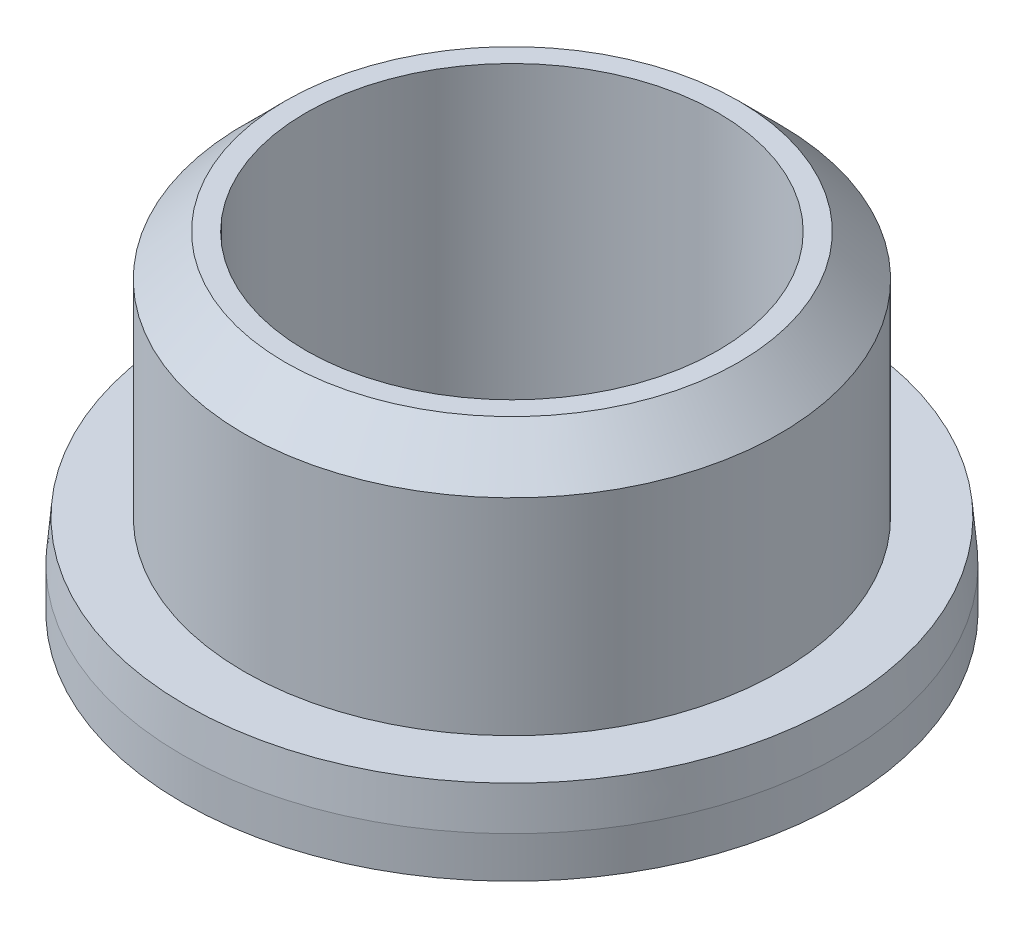
ISO-10303-21;
HEADER;
FILE_DESCRIPTION(('STEP AP214'),'2;1');
FILE_NAME('part.step','',(''),(''),'','','');
FILE_SCHEMA(('AUTOMOTIVE_DESIGN { 1 0 10303 214 1 1 1 1 }'));
ENDSEC;
DATA;
#1=APPLICATION_CONTEXT('core data for automotive mechanical design processes');
#2=APPLICATION_PROTOCOL_DEFINITION('international standard','automotive_design',2000,#1);
#3=PRODUCT_CONTEXT('',#1,'mechanical');
#4=PRODUCT('Part','Part','',(#3));
#5=PRODUCT_RELATED_PRODUCT_CATEGORY('part','',(#4));
#6=PRODUCT_DEFINITION_FORMATION('','',#4);
#7=PRODUCT_DEFINITION_CONTEXT('part definition',#1,'design');
#8=PRODUCT_DEFINITION('design','',#6,#7);
#9=PRODUCT_DEFINITION_SHAPE('','',#8);
#10=(LENGTH_UNIT() NAMED_UNIT(*) SI_UNIT(.MILLI.,.METRE.));
#11=(NAMED_UNIT(*) PLANE_ANGLE_UNIT() SI_UNIT($,.RADIAN.));
#12=(NAMED_UNIT(*) SI_UNIT($,.STERADIAN.) SOLID_ANGLE_UNIT());
#13=UNCERTAINTY_MEASURE_WITH_UNIT(LENGTH_MEASURE(1.E-05),#10,'distance_accuracy_value','');
#14=(GEOMETRIC_REPRESENTATION_CONTEXT(3) GLOBAL_UNCERTAINTY_ASSIGNED_CONTEXT((#13)) GLOBAL_UNIT_ASSIGNED_CONTEXT((#10,
#11,#12)) REPRESENTATION_CONTEXT('',''));
#15=CARTESIAN_POINT('',(0.,0.,0.));
#16=DIRECTION('',(0.,0.,1.));
#17=DIRECTION('',(1.,0.,0.));
#18=AXIS2_PLACEMENT_3D('',#15,#16,#17);
#19=CARTESIAN_POINT('',(0.,2.,0.));
#20=DIRECTION('',(0.,-1.,0.));
#21=DIRECTION('',(0.,0.,-1.));
#22=AXIS2_PLACEMENT_3D('',#19,#20,#21);
#23=CYLINDRICAL_SURFACE('',#22,8.);
#24=CARTESIAN_POINT('',(0.,0.999999999999989,0.));
#25=DIRECTION('',(0.,1.,0.));
#26=DIRECTION('',(0.,0.,1.));
#27=AXIS2_PLACEMENT_3D('',#24,#25,#26);
#28=CIRCLE('',#27,8.);
#29=CARTESIAN_POINT('',(0.,0.999999999999989,8.));
#30=VERTEX_POINT('',#29);
#31=EDGE_CURVE('E10',#30,#30,#28,.F.);
#32=ORIENTED_EDGE('',*,*,#31,.T.);
#33=EDGE_LOOP('',(#32));
#34=FACE_BOUND('',#33,.T.);
#35=CARTESIAN_POINT('',(0.,0.,0.));
#36=DIRECTION('',(0.,1.,0.));
#37=DIRECTION('',(0.,0.,1.));
#38=AXIS2_PLACEMENT_3D('',#35,#36,#37);
#39=CIRCLE('',#38,8.);
#40=CARTESIAN_POINT('',(0.,0.,8.));
#41=VERTEX_POINT('',#40);
#42=EDGE_CURVE('E52',#41,#41,#39,.T.);
#43=ORIENTED_EDGE('',*,*,#42,.T.);
#44=EDGE_LOOP('',(#43));
#45=FACE_BOUND('',#44,.T.);
#46=ADVANCED_FACE('F31',(#34,#45),#23,.T.);
#47=CARTESIAN_POINT('',(0.,2.,0.));
#48=DIRECTION('',(0.,1.,0.));
#49=DIRECTION('',(0.,0.,1.));
#50=AXIS2_PLACEMENT_3D('',#47,#48,#49);
#51=PLANE('',#50);
#52=CARTESIAN_POINT('',(0.,2.,0.));
#53=DIRECTION('',(0.,1.,0.));
#54=DIRECTION('',(0.,0.,1.));
#55=AXIS2_PLACEMENT_3D('',#52,#53,#54);
#56=CIRCLE('',#55,7.91251133647408);
#57=CARTESIAN_POINT('',(0.,2.,7.91251133647408));
#58=VERTEX_POINT('',#57);
#59=EDGE_CURVE('E38',#58,#58,#56,.T.);
#60=ORIENTED_EDGE('',*,*,#59,.T.);
#61=EDGE_LOOP('',(#60));
#62=FACE_BOUND('',#61,.T.);
#63=CARTESIAN_POINT('',(0.,2.,0.));
#64=DIRECTION('',(0.,1.,0.));
#65=DIRECTION('',(0.,0.,1.));
#66=AXIS2_PLACEMENT_3D('',#63,#64,#65);
#67=CIRCLE('',#66,6.5);
#68=CARTESIAN_POINT('',(0.,2.,6.5));
#69=VERTEX_POINT('',#68);
#70=EDGE_CURVE('E51',#69,#69,#67,.T.);
#71=ORIENTED_EDGE('',*,*,#70,.F.);
#72=EDGE_LOOP('',(#71));
#73=FACE_BOUND('',#72,.T.);
#74=ADVANCED_FACE('F85',(#62,#73),#51,.T.);
#75=CARTESIAN_POINT('',(0.,0.,0.));
#76=DIRECTION('',(0.,1.,0.));
#77=DIRECTION('',(0.,0.,1.));
#78=AXIS2_PLACEMENT_3D('',#75,#76,#77);
#79=PLANE('',#78);
#80=CARTESIAN_POINT('',(0.,0.,0.));
#81=DIRECTION('',(0.,1.,0.));
#82=DIRECTION('',(0.,0.,1.));
#83=AXIS2_PLACEMENT_3D('',#80,#81,#82);
#84=CIRCLE('',#83,5.);
#85=CARTESIAN_POINT('',(0.,0.,5.));
#86=VERTEX_POINT('',#85);
#87=EDGE_CURVE('E55',#86,#86,#84,.T.);
#88=ORIENTED_EDGE('',*,*,#87,.T.);
#89=EDGE_LOOP('',(#88));
#90=FACE_BOUND('',#89,.T.);
#91=ORIENTED_EDGE('',*,*,#42,.F.);
#92=EDGE_LOOP('',(#91));
#93=FACE_BOUND('',#92,.T.);
#94=ADVANCED_FACE('F64',(#90,#93),#79,.F.);
#95=CARTESIAN_POINT('',(0.,8.,0.));
#96=DIRECTION('',(0.,-1.,0.));
#97=DIRECTION('',(0.,0.,-1.));
#98=AXIS2_PLACEMENT_3D('',#95,#96,#97);
#99=CYLINDRICAL_SURFACE('',#98,6.5);
#100=CARTESIAN_POINT('',(0.,7.,0.));
#101=DIRECTION('',(0.,1.,0.));
#102=DIRECTION('',(0.,0.,1.));
#103=AXIS2_PLACEMENT_3D('',#100,#101,#102);
#104=CIRCLE('',#103,6.5);
#105=CARTESIAN_POINT('',(0.,7.,6.5));
#106=VERTEX_POINT('',#105);
#107=EDGE_CURVE('E42',#106,#106,#104,.F.);
#108=ORIENTED_EDGE('',*,*,#107,.T.);
#109=EDGE_LOOP('',(#108));
#110=FACE_BOUND('',#109,.T.);
#111=ORIENTED_EDGE('',*,*,#70,.T.);
#112=EDGE_LOOP('',(#111));
#113=FACE_BOUND('',#112,.T.);
#114=ADVANCED_FACE('F76',(#110,#113),#99,.T.);
#115=CARTESIAN_POINT('',(0.,8.,0.));
#116=DIRECTION('',(0.,1.,0.));
#117=DIRECTION('',(0.,0.,1.));
#118=AXIS2_PLACEMENT_3D('',#115,#116,#117);
#119=PLANE('',#118);
#120=CARTESIAN_POINT('',(0.,8.,0.));
#121=DIRECTION('',(0.,1.,0.));
#122=DIRECTION('',(0.,0.,1.));
#123=AXIS2_PLACEMENT_3D('',#120,#121,#122);
#124=CIRCLE('',#123,5.50000000000001);
#125=CARTESIAN_POINT('',(0.,8.,5.50000000000001));
#126=VERTEX_POINT('',#125);
#127=EDGE_CURVE('E46',#126,#126,#124,.T.);
#128=ORIENTED_EDGE('',*,*,#127,.T.);
#129=EDGE_LOOP('',(#128));
#130=FACE_BOUND('',#129,.T.);
#131=CARTESIAN_POINT('',(0.,8.,0.));
#132=DIRECTION('',(0.,1.,0.));
#133=DIRECTION('',(0.,0.,1.));
#134=AXIS2_PLACEMENT_3D('',#131,#132,#133);
#135=CIRCLE('',#134,5.);
#136=CARTESIAN_POINT('',(0.,8.,5.));
#137=VERTEX_POINT('',#136);
#138=EDGE_CURVE('E58',#137,#137,#135,.T.);
#139=ORIENTED_EDGE('',*,*,#138,.F.);
#140=EDGE_LOOP('',(#139));
#141=FACE_BOUND('',#140,.T.);
#142=ADVANCED_FACE('F71',(#130,#141),#119,.T.);
#143=CARTESIAN_POINT('',(0.,0.,0.));
#144=DIRECTION('',(0.,1.,0.));
#145=DIRECTION('',(0.,0.,1.));
#146=AXIS2_PLACEMENT_3D('',#143,#144,#145);
#147=CYLINDRICAL_SURFACE('',#146,5.);
#148=ORIENTED_EDGE('',*,*,#87,.F.);
#149=EDGE_LOOP('',(#148));
#150=FACE_BOUND('',#149,.T.);
#151=ORIENTED_EDGE('',*,*,#138,.T.);
#152=EDGE_LOOP('',(#151));
#153=FACE_BOUND('',#152,.T.);
#154=ADVANCED_FACE('F67',(#150,#153),#147,.F.);
#155=CARTESIAN_POINT('',(0.,8.,0.));
#156=DIRECTION('',(0.,-1.,0.));
#157=DIRECTION('',(0.,0.,-1.));
#158=AXIS2_PLACEMENT_3D('',#155,#156,#157);
#159=CONICAL_SURFACE('',#158,5.50000000000001,0.785398163397446);
#160=ORIENTED_EDGE('',*,*,#107,.F.);
#161=EDGE_LOOP('',(#160));
#162=FACE_BOUND('',#161,.T.);
#163=ORIENTED_EDGE('',*,*,#127,.F.);
#164=EDGE_LOOP('',(#163));
#165=FACE_BOUND('',#164,.T.);
#166=ADVANCED_FACE('F70',(#162,#165),#159,.T.);
#167=CARTESIAN_POINT('',(0.,2.,0.));
#168=DIRECTION('',(0.,-1.,0.));
#169=DIRECTION('',(0.,0.,-1.));
#170=AXIS2_PLACEMENT_3D('',#167,#168,#169);
#171=CONICAL_SURFACE('',#170,7.91251133647408,0.0872664625997116);
#172=ORIENTED_EDGE('',*,*,#31,.F.);
#173=EDGE_LOOP('',(#172));
#174=FACE_BOUND('',#173,.T.);
#175=ORIENTED_EDGE('',*,*,#59,.F.);
#176=EDGE_LOOP('',(#175));
#177=FACE_BOUND('',#176,.T.);
#178=ADVANCED_FACE('F33',(#174,#177),#171,.T.);
#179=CLOSED_SHELL('',(#46,#74,#94,#114,#142,#154,#166,#178));
#180=MANIFOLD_SOLID_BREP('B2',#179);
#181=ADVANCED_BREP_SHAPE_REPRESENTATION('',(#18,#180),#14);
#182=SHAPE_DEFINITION_REPRESENTATION(#9,#181);
ENDSEC;
END-ISO-10303-21;
